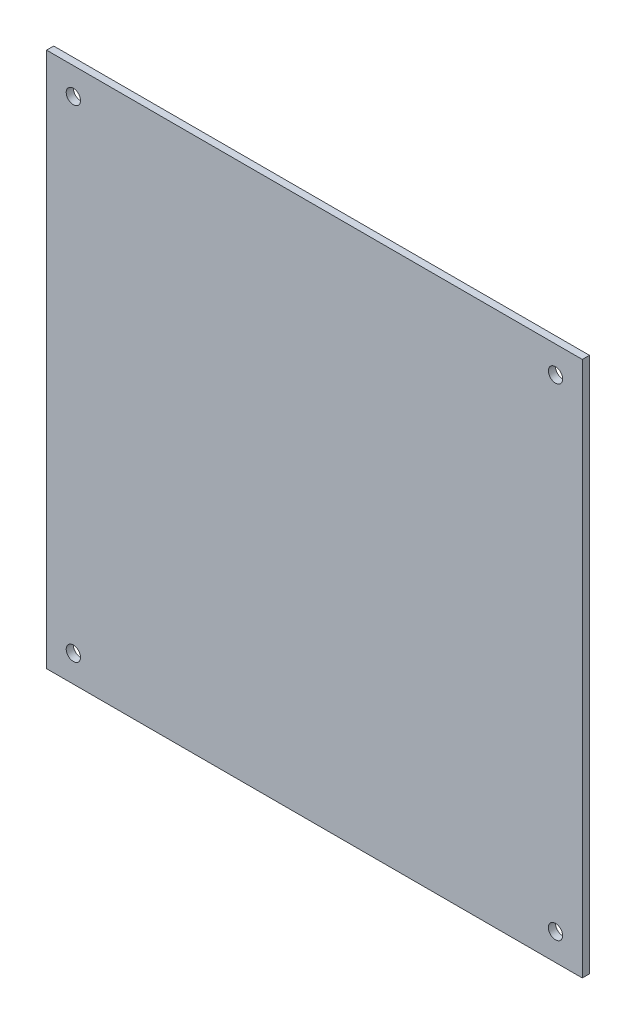
ISO-10303-21;
HEADER;
FILE_DESCRIPTION(('STEP AP214'),'2;1');
FILE_NAME('part.step','',(''),(''),'','','');
FILE_SCHEMA(('AUTOMOTIVE_DESIGN { 1 0 10303 214 1 1 1 1 }'));
ENDSEC;
DATA;
#1=APPLICATION_CONTEXT('core data for automotive mechanical design processes');
#2=APPLICATION_PROTOCOL_DEFINITION('international standard','automotive_design',2000,#1);
#3=PRODUCT_CONTEXT('',#1,'mechanical');
#4=PRODUCT('Part','Part','',(#3));
#5=PRODUCT_RELATED_PRODUCT_CATEGORY('part','',(#4));
#6=PRODUCT_DEFINITION_FORMATION('','',#4);
#7=PRODUCT_DEFINITION_CONTEXT('part definition',#1,'design');
#8=PRODUCT_DEFINITION('design','',#6,#7);
#9=PRODUCT_DEFINITION_SHAPE('','',#8);
#10=(LENGTH_UNIT() NAMED_UNIT(*) SI_UNIT(.MILLI.,.METRE.));
#11=(NAMED_UNIT(*) PLANE_ANGLE_UNIT() SI_UNIT($,.RADIAN.));
#12=(NAMED_UNIT(*) SI_UNIT($,.STERADIAN.) SOLID_ANGLE_UNIT());
#13=UNCERTAINTY_MEASURE_WITH_UNIT(LENGTH_MEASURE(1.E-05),#10,'distance_accuracy_value','');
#14=(GEOMETRIC_REPRESENTATION_CONTEXT(3) GLOBAL_UNCERTAINTY_ASSIGNED_CONTEXT((#13)) GLOBAL_UNIT_ASSIGNED_CONTEXT((#10,
#11,#12)) REPRESENTATION_CONTEXT('',''));
#15=CARTESIAN_POINT('',(0.,0.,0.));
#16=DIRECTION('',(0.,0.,1.));
#17=DIRECTION('',(1.,0.,0.));
#18=AXIS2_PLACEMENT_3D('',#15,#16,#17);
#19=CARTESIAN_POINT('',(75.,-75.,2.));
#20=DIRECTION('',(-1.,0.,0.));
#21=DIRECTION('',(0.,0.,1.));
#22=AXIS2_PLACEMENT_3D('',#19,#20,#21);
#23=PLANE('',#22);
#24=DIRECTION('',(0.,1.,0.));
#25=VECTOR('',#24,1.);
#26=CARTESIAN_POINT('',(75.,-75.,0.));
#27=LINE('',#26,#25);
#28=CARTESIAN_POINT('',(75.,-75.,0.));
#29=VERTEX_POINT('',#28);
#30=CARTESIAN_POINT('',(75.,75.,0.));
#31=VERTEX_POINT('',#30);
#32=EDGE_CURVE('E96',#29,#31,#27,.T.);
#33=ORIENTED_EDGE('',*,*,#32,.T.);
#34=DIRECTION('',(0.,0.,-1.));
#35=VECTOR('',#34,1.);
#36=CARTESIAN_POINT('',(75.,75.,2.));
#37=LINE('',#36,#35);
#38=CARTESIAN_POINT('',(75.,75.,2.));
#39=VERTEX_POINT('',#38);
#40=EDGE_CURVE('E11',#39,#31,#37,.T.);
#41=ORIENTED_EDGE('',*,*,#40,.F.);
#42=DIRECTION('',(0.,1.,0.));
#43=VECTOR('',#42,1.);
#44=CARTESIAN_POINT('',(75.,-75.,2.));
#45=LINE('',#44,#43);
#46=CARTESIAN_POINT('',(75.,-75.,2.));
#47=VERTEX_POINT('',#46);
#48=EDGE_CURVE('E84',#47,#39,#45,.T.);
#49=ORIENTED_EDGE('',*,*,#48,.F.);
#50=DIRECTION('',(0.,0.,-1.));
#51=VECTOR('',#50,1.);
#52=CARTESIAN_POINT('',(75.,-75.,2.));
#53=LINE('',#52,#51);
#54=EDGE_CURVE('E92',#47,#29,#53,.T.);
#55=ORIENTED_EDGE('',*,*,#54,.T.);
#56=EDGE_LOOP('',(#33,#41,#49,#55));
#57=FACE_BOUND('',#56,.T.);
#58=ADVANCED_FACE('F33',(#57),#23,.F.);
#59=CARTESIAN_POINT('',(-75.,75.,2.));
#60=DIRECTION('',(0.,-1.,0.));
#61=DIRECTION('',(0.,0.,-1.));
#62=AXIS2_PLACEMENT_3D('',#59,#60,#61);
#63=PLANE('',#62);
#64=DIRECTION('',(-1.,0.,0.));
#65=VECTOR('',#64,1.);
#66=CARTESIAN_POINT('',(-75.,75.,0.));
#67=LINE('',#66,#65);
#68=CARTESIAN_POINT('',(-75.,75.,0.));
#69=VERTEX_POINT('',#68);
#70=EDGE_CURVE('E88',#31,#69,#67,.T.);
#71=ORIENTED_EDGE('',*,*,#70,.T.);
#72=DIRECTION('',(0.,0.,-1.));
#73=VECTOR('',#72,1.);
#74=CARTESIAN_POINT('',(-75.,75.,2.));
#75=LINE('',#74,#73);
#76=CARTESIAN_POINT('',(-75.,75.,2.));
#77=VERTEX_POINT('',#76);
#78=EDGE_CURVE('E41',#77,#69,#75,.T.);
#79=ORIENTED_EDGE('',*,*,#78,.F.);
#80=DIRECTION('',(-1.,0.,0.));
#81=VECTOR('',#80,1.);
#82=CARTESIAN_POINT('',(-75.,75.,2.));
#83=LINE('',#82,#81);
#84=EDGE_CURVE('E79',#39,#77,#83,.T.);
#85=ORIENTED_EDGE('',*,*,#84,.F.);
#86=ORIENTED_EDGE('',*,*,#40,.T.);
#87=EDGE_LOOP('',(#71,#79,#85,#86));
#88=FACE_BOUND('',#87,.T.);
#89=ADVANCED_FACE('F87',(#88),#63,.F.);
#90=CARTESIAN_POINT('',(-75.,-75.,2.));
#91=DIRECTION('',(1.,0.,0.));
#92=DIRECTION('',(0.,0.,-1.));
#93=AXIS2_PLACEMENT_3D('',#90,#91,#92);
#94=PLANE('',#93);
#95=DIRECTION('',(0.,-1.,0.));
#96=VECTOR('',#95,1.);
#97=CARTESIAN_POINT('',(-75.,-75.,0.));
#98=LINE('',#97,#96);
#99=CARTESIAN_POINT('',(-75.,-75.,0.));
#100=VERTEX_POINT('',#99);
#101=EDGE_CURVE('E66',#69,#100,#98,.T.);
#102=ORIENTED_EDGE('',*,*,#101,.T.);
#103=DIRECTION('',(0.,0.,-1.));
#104=VECTOR('',#103,1.);
#105=CARTESIAN_POINT('',(-75.,-75.,2.));
#106=LINE('',#105,#104);
#107=CARTESIAN_POINT('',(-75.,-75.,2.));
#108=VERTEX_POINT('',#107);
#109=EDGE_CURVE('E89',#108,#100,#106,.T.);
#110=ORIENTED_EDGE('',*,*,#109,.F.);
#111=DIRECTION('',(0.,-1.,0.));
#112=VECTOR('',#111,1.);
#113=CARTESIAN_POINT('',(-75.,-75.,2.));
#114=LINE('',#113,#112);
#115=EDGE_CURVE('E82',#77,#108,#114,.T.);
#116=ORIENTED_EDGE('',*,*,#115,.F.);
#117=ORIENTED_EDGE('',*,*,#78,.T.);
#118=EDGE_LOOP('',(#102,#110,#116,#117));
#119=FACE_BOUND('',#118,.T.);
#120=ADVANCED_FACE('F90',(#119),#94,.F.);
#121=CARTESIAN_POINT('',(-75.,-75.,2.));
#122=DIRECTION('',(0.,1.,0.));
#123=DIRECTION('',(-1.,0.,0.));
#124=AXIS2_PLACEMENT_3D('',#121,#122,#123);
#125=PLANE('',#124);
#126=DIRECTION('',(1.,0.,0.));
#127=VECTOR('',#126,1.);
#128=CARTESIAN_POINT('',(-75.,-75.,0.));
#129=LINE('',#128,#127);
#130=EDGE_CURVE('E72',#100,#29,#129,.T.);
#131=ORIENTED_EDGE('',*,*,#130,.T.);
#132=ORIENTED_EDGE('',*,*,#54,.F.);
#133=DIRECTION('',(1.,0.,0.));
#134=VECTOR('',#133,1.);
#135=CARTESIAN_POINT('',(-75.,-75.,2.));
#136=LINE('',#135,#134);
#137=EDGE_CURVE('E49',#108,#47,#136,.T.);
#138=ORIENTED_EDGE('',*,*,#137,.F.);
#139=ORIENTED_EDGE('',*,*,#109,.T.);
#140=EDGE_LOOP('',(#131,#132,#138,#139));
#141=FACE_BOUND('',#140,.T.);
#142=ADVANCED_FACE('F104',(#141),#125,.F.);
#143=CARTESIAN_POINT('',(0.,0.,2.));
#144=DIRECTION('',(0.,0.,-1.));
#145=DIRECTION('',(-1.,0.,0.));
#146=AXIS2_PLACEMENT_3D('',#143,#144,#145);
#147=PLANE('',#146);
#148=CARTESIAN_POINT('',(-67.5,-67.5,2.));
#149=DIRECTION('',(0.,0.,1.));
#150=DIRECTION('',(1.,0.,0.));
#151=AXIS2_PLACEMENT_3D('',#148,#149,#150);
#152=CIRCLE('',#151,2.);
#153=CARTESIAN_POINT('',(-65.5,-67.5,2.));
#154=VERTEX_POINT('',#153);
#155=EDGE_CURVE('E125',#154,#154,#152,.T.);
#156=ORIENTED_EDGE('',*,*,#155,.F.);
#157=EDGE_LOOP('',(#156));
#158=FACE_BOUND('',#157,.T.);
#159=CARTESIAN_POINT('',(-67.5000000000005,67.5,2.));
#160=DIRECTION('',(0.,0.,1.));
#161=DIRECTION('',(1.,0.,0.));
#162=AXIS2_PLACEMENT_3D('',#159,#160,#161);
#163=CIRCLE('',#162,2.);
#164=CARTESIAN_POINT('',(-65.5000000000005,67.5,2.));
#165=VERTEX_POINT('',#164);
#166=EDGE_CURVE('E119',#165,#165,#163,.T.);
#167=ORIENTED_EDGE('',*,*,#166,.F.);
#168=EDGE_LOOP('',(#167));
#169=FACE_BOUND('',#168,.T.);
#170=CARTESIAN_POINT('',(67.4999999999995,67.5,2.));
#171=DIRECTION('',(0.,0.,1.));
#172=DIRECTION('',(1.,0.,0.));
#173=AXIS2_PLACEMENT_3D('',#170,#171,#172);
#174=CIRCLE('',#173,2.);
#175=CARTESIAN_POINT('',(69.4999999999995,67.5,2.));
#176=VERTEX_POINT('',#175);
#177=EDGE_CURVE('E113',#176,#176,#174,.T.);
#178=ORIENTED_EDGE('',*,*,#177,.F.);
#179=EDGE_LOOP('',(#178));
#180=FACE_BOUND('',#179,.T.);
#181=CARTESIAN_POINT('',(67.5,-67.5,2.));
#182=DIRECTION('',(0.,0.,1.));
#183=DIRECTION('',(1.,0.,0.));
#184=AXIS2_PLACEMENT_3D('',#181,#182,#183);
#185=CIRCLE('',#184,2.);
#186=CARTESIAN_POINT('',(69.5,-67.5,2.));
#187=VERTEX_POINT('',#186);
#188=EDGE_CURVE('E110',#187,#187,#185,.T.);
#189=ORIENTED_EDGE('',*,*,#188,.F.);
#190=EDGE_LOOP('',(#189));
#191=FACE_BOUND('',#190,.T.);
#192=ORIENTED_EDGE('',*,*,#48,.T.);
#193=ORIENTED_EDGE('',*,*,#84,.T.);
#194=ORIENTED_EDGE('',*,*,#115,.T.);
#195=ORIENTED_EDGE('',*,*,#137,.T.);
#196=EDGE_LOOP('',(#192,#193,#194,#195));
#197=FACE_BOUND('',#196,.T.);
#198=ADVANCED_FACE('F80',(#158,#169,#180,#191,#197),#147,.F.);
#199=CARTESIAN_POINT('',(0.,0.,0.));
#200=DIRECTION('',(0.,0.,-1.));
#201=DIRECTION('',(-1.,0.,0.));
#202=AXIS2_PLACEMENT_3D('',#199,#200,#201);
#203=PLANE('',#202);
#204=CARTESIAN_POINT('',(-67.5,-67.5,0.));
#205=DIRECTION('',(0.,0.,1.));
#206=DIRECTION('',(1.,0.,0.));
#207=AXIS2_PLACEMENT_3D('',#204,#205,#206);
#208=CIRCLE('',#207,2.);
#209=CARTESIAN_POINT('',(-65.5,-67.5,0.));
#210=VERTEX_POINT('',#209);
#211=EDGE_CURVE('E128',#210,#210,#208,.T.);
#212=ORIENTED_EDGE('',*,*,#211,.T.);
#213=EDGE_LOOP('',(#212));
#214=FACE_BOUND('',#213,.T.);
#215=CARTESIAN_POINT('',(-67.5000000000005,67.5,0.));
#216=DIRECTION('',(0.,0.,1.));
#217=DIRECTION('',(1.,0.,0.));
#218=AXIS2_PLACEMENT_3D('',#215,#216,#217);
#219=CIRCLE('',#218,2.);
#220=CARTESIAN_POINT('',(-65.5000000000005,67.5,0.));
#221=VERTEX_POINT('',#220);
#222=EDGE_CURVE('E122',#221,#221,#219,.T.);
#223=ORIENTED_EDGE('',*,*,#222,.T.);
#224=EDGE_LOOP('',(#223));
#225=FACE_BOUND('',#224,.T.);
#226=CARTESIAN_POINT('',(67.4999999999995,67.5,0.));
#227=DIRECTION('',(0.,0.,1.));
#228=DIRECTION('',(1.,0.,0.));
#229=AXIS2_PLACEMENT_3D('',#226,#227,#228);
#230=CIRCLE('',#229,2.);
#231=CARTESIAN_POINT('',(69.4999999999995,67.5,0.));
#232=VERTEX_POINT('',#231);
#233=EDGE_CURVE('E116',#232,#232,#230,.T.);
#234=ORIENTED_EDGE('',*,*,#233,.T.);
#235=EDGE_LOOP('',(#234));
#236=FACE_BOUND('',#235,.T.);
#237=CARTESIAN_POINT('',(67.5,-67.5,0.));
#238=DIRECTION('',(0.,0.,1.));
#239=DIRECTION('',(1.,0.,0.));
#240=AXIS2_PLACEMENT_3D('',#237,#238,#239);
#241=CIRCLE('',#240,2.);
#242=CARTESIAN_POINT('',(69.5,-67.5,0.));
#243=VERTEX_POINT('',#242);
#244=EDGE_CURVE('E99',#243,#243,#241,.T.);
#245=ORIENTED_EDGE('',*,*,#244,.T.);
#246=EDGE_LOOP('',(#245));
#247=FACE_BOUND('',#246,.T.);
#248=ORIENTED_EDGE('',*,*,#32,.F.);
#249=ORIENTED_EDGE('',*,*,#130,.F.);
#250=ORIENTED_EDGE('',*,*,#101,.F.);
#251=ORIENTED_EDGE('',*,*,#70,.F.);
#252=EDGE_LOOP('',(#248,#249,#250,#251));
#253=FACE_BOUND('',#252,.T.);
#254=ADVANCED_FACE('F107',(#214,#225,#236,#247,#253),#203,.T.);
#255=CARTESIAN_POINT('',(67.5,-67.5,0.));
#256=DIRECTION('',(0.,0.,1.));
#257=DIRECTION('',(1.,0.,0.));
#258=AXIS2_PLACEMENT_3D('',#255,#256,#257);
#259=CYLINDRICAL_SURFACE('',#258,2.);
#260=ORIENTED_EDGE('',*,*,#244,.F.);
#261=EDGE_LOOP('',(#260));
#262=FACE_BOUND('',#261,.T.);
#263=ORIENTED_EDGE('',*,*,#188,.T.);
#264=EDGE_LOOP('',(#263));
#265=FACE_BOUND('',#264,.T.);
#266=ADVANCED_FACE('F145',(#262,#265),#259,.F.);
#267=CARTESIAN_POINT('',(67.4999999999995,67.5,0.));
#268=DIRECTION('',(0.,0.,1.));
#269=DIRECTION('',(1.,0.,0.));
#270=AXIS2_PLACEMENT_3D('',#267,#268,#269);
#271=CYLINDRICAL_SURFACE('',#270,2.);
#272=ORIENTED_EDGE('',*,*,#233,.F.);
#273=EDGE_LOOP('',(#272));
#274=FACE_BOUND('',#273,.T.);
#275=ORIENTED_EDGE('',*,*,#177,.T.);
#276=EDGE_LOOP('',(#275));
#277=FACE_BOUND('',#276,.T.);
#278=ADVANCED_FACE('F147',(#274,#277),#271,.F.);
#279=CARTESIAN_POINT('',(-67.5000000000005,67.5,0.));
#280=DIRECTION('',(0.,0.,1.));
#281=DIRECTION('',(1.,0.,0.));
#282=AXIS2_PLACEMENT_3D('',#279,#280,#281);
#283=CYLINDRICAL_SURFACE('',#282,2.);
#284=ORIENTED_EDGE('',*,*,#222,.F.);
#285=EDGE_LOOP('',(#284));
#286=FACE_BOUND('',#285,.T.);
#287=ORIENTED_EDGE('',*,*,#166,.T.);
#288=EDGE_LOOP('',(#287));
#289=FACE_BOUND('',#288,.T.);
#290=ADVANCED_FACE('F154',(#286,#289),#283,.F.);
#291=CARTESIAN_POINT('',(-67.5,-67.5,0.));
#292=DIRECTION('',(0.,0.,1.));
#293=DIRECTION('',(1.,0.,0.));
#294=AXIS2_PLACEMENT_3D('',#291,#292,#293);
#295=CYLINDRICAL_SURFACE('',#294,2.);
#296=ORIENTED_EDGE('',*,*,#211,.F.);
#297=EDGE_LOOP('',(#296));
#298=FACE_BOUND('',#297,.T.);
#299=ORIENTED_EDGE('',*,*,#155,.T.);
#300=EDGE_LOOP('',(#299));
#301=FACE_BOUND('',#300,.T.);
#302=ADVANCED_FACE('F134',(#298,#301),#295,.F.);
#303=CLOSED_SHELL('',(#58,#89,#120,#142,#198,#254,#266,#278,#290,#302));
#304=MANIFOLD_SOLID_BREP('B2',#303);
#305=ADVANCED_BREP_SHAPE_REPRESENTATION('',(#18,#304),#14);
#306=SHAPE_DEFINITION_REPRESENTATION(#9,#305);
ENDSEC;
END-ISO-10303-21;
